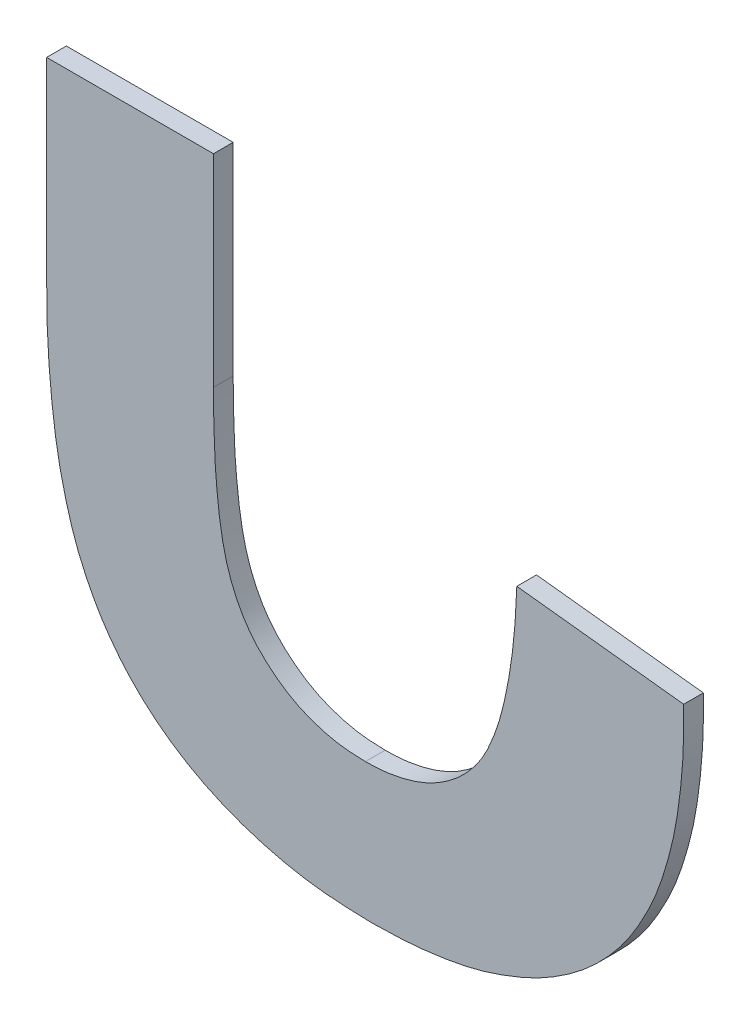
ISO-10303-21;
HEADER;
FILE_DESCRIPTION(('STEP AP214'),'2;1');
FILE_NAME('part.step','',(''),(''),'','','');
FILE_SCHEMA(('AUTOMOTIVE_DESIGN { 1 0 10303 214 1 1 1 1 }'));
ENDSEC;
DATA;
#1=APPLICATION_CONTEXT('core data for automotive mechanical design processes');
#2=APPLICATION_PROTOCOL_DEFINITION('international standard','automotive_design',2000,#1);
#3=PRODUCT_CONTEXT('',#1,'mechanical');
#4=PRODUCT('Part','Part','',(#3));
#5=PRODUCT_RELATED_PRODUCT_CATEGORY('part','',(#4));
#6=PRODUCT_DEFINITION_FORMATION('','',#4);
#7=PRODUCT_DEFINITION_CONTEXT('part definition',#1,'design');
#8=PRODUCT_DEFINITION('design','',#6,#7);
#9=PRODUCT_DEFINITION_SHAPE('','',#8);
#10=(LENGTH_UNIT() NAMED_UNIT(*) SI_UNIT(.MILLI.,.METRE.));
#11=(NAMED_UNIT(*) PLANE_ANGLE_UNIT() SI_UNIT($,.RADIAN.));
#12=(NAMED_UNIT(*) SI_UNIT($,.STERADIAN.) SOLID_ANGLE_UNIT());
#13=UNCERTAINTY_MEASURE_WITH_UNIT(LENGTH_MEASURE(1.E-05),#10,'distance_accuracy_value','');
#14=(GEOMETRIC_REPRESENTATION_CONTEXT(3) GLOBAL_UNCERTAINTY_ASSIGNED_CONTEXT((#13)) GLOBAL_UNIT_ASSIGNED_CONTEXT((#10,
#11,#12)) REPRESENTATION_CONTEXT('',''));
#15=CARTESIAN_POINT('',(0.,0.,0.));
#16=DIRECTION('',(0.,0.,1.));
#17=DIRECTION('',(1.,0.,0.));
#18=AXIS2_PLACEMENT_3D('',#15,#16,#17);
#19=CARTESIAN_POINT('',(1.15985576923078,-11.9230769230769,0.5));
#20=CARTESIAN_POINT('',(0.952681705237185,-11.9161438324762,0.5));
#21=CARTESIAN_POINT('',(0.547863750540508,-11.9025965790092,0.5));
#22=CARTESIAN_POINT('',(-0.032799948601432,-11.763362607753,0.5));
#23=CARTESIAN_POINT('',(-0.573838441220943,-11.5544629402978,0.5));
#24=CARTESIAN_POINT('',(-1.05994932250137,-11.2494384315448,0.5));
#25=CARTESIAN_POINT('',(-1.49335071651951,-10.878283181554,0.5));
#26=CARTESIAN_POINT('',(-1.86201258483458,-10.4402967865466,0.5));
#27=CARTESIAN_POINT('',(-2.14283461856344,-9.93412421585018,0.5));
#28=CARTESIAN_POINT('',(-2.31970215721966,-9.46678875517175,0.5));
#29=CARTESIAN_POINT('',(-2.42819410064458,-9.05083766607445,0.5));
#30=CARTESIAN_POINT('',(-2.49919635358074,-8.68949218820357,0.5));
#31=CARTESIAN_POINT('',(-2.55905493719061,-8.28637233568953,0.5));
#32=CARTESIAN_POINT('',(-2.60426724061429,-7.8389515636549,0.5));
#33=CARTESIAN_POINT('',(-2.6501684689034,-7.34852799709661,0.5));
#34=CARTESIAN_POINT('',(-2.6685057339471,-6.81295786338951,0.5));
#35=CARTESIAN_POINT('',(-2.68987936086344,-6.23614177366569,0.5));
#36=CARTESIAN_POINT('',(-2.69147960263964,-5.83736681973611,0.5));
#37=CARTESIAN_POINT('',(-2.69230769230768,-5.63100961538462,0.5));
#38=B_SPLINE_CURVE_WITH_KNOTS('',3,(#19,#20,#21,#22,#23,#24,#25,#26,#27,#28,#29,#30,#31,#32,#33,
#34,#35,#36,#37),.UNSPECIFIED.,.F.,.F.,(4,1,1,1,1,1,1,1,1,1,1,1,1,1,1,1,4),(0.,
0.0735942393366711,0.143803084572642,0.211314618374481,0.27917152037263,0.346904742846469,
0.413716381936235,0.481711687395285,0.551880712199704,0.590958340806243,0.634577157821114,
0.682868023604495,0.73592724163968,0.794594595566814,0.858103431572018,0.926571669360561,1.),.UNSPECIFIED.);
#39=DIRECTION('',(0.,0.,-1.));
#40=VECTOR('',#39,1.);
#41=SURFACE_OF_LINEAR_EXTRUSION('',#38,#40);
#42=CARTESIAN_POINT('',(1.15985576923078,-11.9230769230769,0.));
#43=CARTESIAN_POINT('',(0.952681705237185,-11.9161438324762,0.));
#44=CARTESIAN_POINT('',(0.547863750540508,-11.9025965790092,0.));
#45=CARTESIAN_POINT('',(-0.032799948601432,-11.763362607753,0.));
#46=CARTESIAN_POINT('',(-0.573838441220943,-11.5544629402978,0.));
#47=CARTESIAN_POINT('',(-1.05994932250137,-11.2494384315448,0.));
#48=CARTESIAN_POINT('',(-1.49335071651951,-10.878283181554,0.));
#49=CARTESIAN_POINT('',(-1.86201258483458,-10.4402967865466,0.));
#50=CARTESIAN_POINT('',(-2.14283461856344,-9.93412421585018,0.));
#51=CARTESIAN_POINT('',(-2.31970215721966,-9.46678875517175,0.));
#52=CARTESIAN_POINT('',(-2.42819410064458,-9.05083766607445,0.));
#53=CARTESIAN_POINT('',(-2.49919635358074,-8.68949218820357,0.));
#54=CARTESIAN_POINT('',(-2.55905493719061,-8.28637233568953,0.));
#55=CARTESIAN_POINT('',(-2.60426724061429,-7.8389515636549,0.));
#56=CARTESIAN_POINT('',(-2.6501684689034,-7.34852799709661,0.));
#57=CARTESIAN_POINT('',(-2.6685057339471,-6.81295786338951,0.));
#58=CARTESIAN_POINT('',(-2.68987936086344,-6.23614177366569,0.));
#59=CARTESIAN_POINT('',(-2.69147960263964,-5.83736681973611,0.));
#60=CARTESIAN_POINT('',(-2.69230769230768,-5.63100961538462,0.));
#61=B_SPLINE_CURVE_WITH_KNOTS('',3,(#42,#43,#44,#45,#46,#47,#48,#49,#50,#51,#52,#53,#54,#55,#56,
#57,#58,#59,#60),.UNSPECIFIED.,.F.,.F.,(4,1,1,1,1,1,1,1,1,1,1,1,1,1,1,1,4),(0.,
0.0735942393366711,0.143803084572642,0.211314618374481,0.27917152037263,0.346904742846469,
0.413716381936235,0.481711687395285,0.551880712199704,0.590958340806243,0.634577157821114,
0.682868023604495,0.73592724163968,0.794594595566814,0.858103431572018,0.926571669360561,1.),.UNSPECIFIED.);
#62=CARTESIAN_POINT('',(1.15985576923078,-11.9230769230769,0.));
#63=VERTEX_POINT('',#62);
#64=CARTESIAN_POINT('',(-2.69230769230768,-5.63100961538462,0.));
#65=VERTEX_POINT('',#64);
#66=EDGE_CURVE('E146',#63,#65,#61,.T.);
#67=ORIENTED_EDGE('',*,*,#66,.T.);
#68=DIRECTION('',(0.,0.,-1.));
#69=VECTOR('',#68,1.);
#70=CARTESIAN_POINT('',(-2.69230769230768,-5.63100961538462,0.5));
#71=LINE('',#70,#69);
#72=CARTESIAN_POINT('',(-2.69230769230768,-5.63100961538462,0.5));
#73=VERTEX_POINT('',#72);
#74=EDGE_CURVE('E170',#73,#65,#71,.T.);
#75=ORIENTED_EDGE('',*,*,#74,.F.);
#76=CARTESIAN_POINT('',(1.15985576923078,-11.9230769230769,0.5));
#77=VERTEX_POINT('',#76);
#78=EDGE_CURVE('E196',#77,#73,#38,.T.);
#79=ORIENTED_EDGE('',*,*,#78,.F.);
#80=DIRECTION('',(0.,0.,-1.));
#81=VECTOR('',#80,1.);
#82=CARTESIAN_POINT('',(1.15985576923078,-11.9230769230769,0.5));
#83=LINE('',#82,#81);
#84=EDGE_CURVE('E175',#77,#63,#83,.T.);
#85=ORIENTED_EDGE('',*,*,#84,.T.);
#86=EDGE_LOOP('',(#67,#75,#79,#85));
#87=FACE_BOUND('',#86,.T.);
#88=ADVANCED_FACE('F39',(#87),#41,.F.);
#89=CARTESIAN_POINT('',(5.00000000000001,-6.15384615384616,0.5));
#90=CARTESIAN_POINT('',(4.98856918952708,-6.42043741379355,0.5));
#91=CARTESIAN_POINT('',(4.96670234798915,-6.93041952315262,0.5));
#92=CARTESIAN_POINT('',(4.89420539736638,-7.66256876119748,0.5));
#93=CARTESIAN_POINT('',(4.79300154625236,-8.32847650193863,0.5));
#94=CARTESIAN_POINT('',(4.66767653580507,-8.93057463982405,0.5));
#95=CARTESIAN_POINT('',(4.52167563144463,-9.46928108839123,0.5));
#96=CARTESIAN_POINT('',(4.33849336266681,-9.94024964370403,0.5));
#97=CARTESIAN_POINT('',(4.14120744960806,-10.3533755180041,0.5));
#98=CARTESIAN_POINT('',(3.89864166780368,-10.6958074578512,0.5));
#99=CARTESIAN_POINT('',(3.63856944258544,-10.9884676468021,0.5));
#100=CARTESIAN_POINT('',(3.35246727573363,-11.2369637779818,0.5));
#101=CARTESIAN_POINT('',(3.04402596997071,-11.4487161365401,0.5));
#102=CARTESIAN_POINT('',(2.71386028716153,-11.6236399860127,0.5));
#103=CARTESIAN_POINT('',(2.35825549843146,-11.7578144068067,0.5));
#104=CARTESIAN_POINT('',(1.98090808143487,-11.8510166509758,0.5));
#105=CARTESIAN_POINT('',(1.57870748483097,-11.9155382902206,0.5));
#106=CARTESIAN_POINT('',(1.3023539002195,-11.920512194195,0.5));
#107=CARTESIAN_POINT('',(1.15985576923078,-11.9230769230769,0.5));
#108=B_SPLINE_CURVE_WITH_KNOTS('',3,(#89,#90,#91,#92,#93,#94,#95,#96,#97,#98,#99,#100,#101,#102,
#103,#104,#105,#106,#107),.UNSPECIFIED.,.F.,.F.,(4,1,1,1,1,1,1,1,1,1,1,1,1,1,1,1,4),(0.,
0.102038712697641,0.195197389247103,0.281231403879794,0.359517329992388,0.430343554209353,
0.494370791233012,0.552618193978707,0.604901827841917,0.654275293347834,0.702059837392702,
0.749449664968405,0.797086573611867,0.844612454737341,0.89441207169847,0.945554958300642,1.),.UNSPECIFIED.);
#109=DIRECTION('',(0.,0.,-1.));
#110=VECTOR('',#109,1.);
#111=SURFACE_OF_LINEAR_EXTRUSION('',#108,#110);
#112=CARTESIAN_POINT('',(5.00000000000001,-6.15384615384616,0.));
#113=CARTESIAN_POINT('',(4.98856918952708,-6.42043741379355,0.));
#114=CARTESIAN_POINT('',(4.96670234798915,-6.93041952315262,0.));
#115=CARTESIAN_POINT('',(4.89420539736638,-7.66256876119748,0.));
#116=CARTESIAN_POINT('',(4.79300154625236,-8.32847650193863,0.));
#117=CARTESIAN_POINT('',(4.66767653580507,-8.93057463982405,0.));
#118=CARTESIAN_POINT('',(4.52167563144463,-9.46928108839123,0.));
#119=CARTESIAN_POINT('',(4.33849336266681,-9.94024964370403,0.));
#120=CARTESIAN_POINT('',(4.14120744960806,-10.3533755180041,0.));
#121=CARTESIAN_POINT('',(3.89864166780368,-10.6958074578512,0.));
#122=CARTESIAN_POINT('',(3.63856944258544,-10.9884676468021,0.));
#123=CARTESIAN_POINT('',(3.35246727573363,-11.2369637779818,0.));
#124=CARTESIAN_POINT('',(3.04402596997071,-11.4487161365401,0.));
#125=CARTESIAN_POINT('',(2.71386028716153,-11.6236399860127,0.));
#126=CARTESIAN_POINT('',(2.35825549843146,-11.7578144068067,0.));
#127=CARTESIAN_POINT('',(1.98090808143487,-11.8510166509758,0.));
#128=CARTESIAN_POINT('',(1.57870748483097,-11.9155382902206,0.));
#129=CARTESIAN_POINT('',(1.3023539002195,-11.920512194195,0.));
#130=CARTESIAN_POINT('',(1.15985576923078,-11.9230769230769,0.));
#131=B_SPLINE_CURVE_WITH_KNOTS('',3,(#112,#113,#114,#115,#116,#117,#118,#119,#120,#121,#122,
#123,#124,#125,#126,#127,#128,#129,#130),.UNSPECIFIED.,.F.,.F.,(4,1,1,1,1,1,1,1,1,1,1,1,1,1,1,1,
4),(0.,0.102038712697641,0.195197389247103,0.281231403879794,0.359517329992388,
0.430343554209353,0.494370791233012,0.552618193978707,0.604901827841917,0.654275293347834,
0.702059837392702,0.749449664968405,0.797086573611867,0.844612454737341,0.89441207169847,
0.945554958300642,1.),.UNSPECIFIED.);
#132=CARTESIAN_POINT('',(5.00000000000001,-6.15384615384616,0.));
#133=VERTEX_POINT('',#132);
#134=EDGE_CURVE('E135',#133,#63,#131,.T.);
#135=ORIENTED_EDGE('',*,*,#134,.T.);
#136=ORIENTED_EDGE('',*,*,#84,.F.);
#137=CARTESIAN_POINT('',(5.00000000000001,-6.15384615384616,0.5));
#138=VERTEX_POINT('',#137);
#139=EDGE_CURVE('E183',#138,#77,#108,.T.);
#140=ORIENTED_EDGE('',*,*,#139,.F.);
#141=DIRECTION('',(0.,0.,-1.));
#142=VECTOR('',#141,1.);
#143=CARTESIAN_POINT('',(5.00000000000001,-6.15384615384616,0.5));
#144=LINE('',#143,#142);
#145=EDGE_CURVE('E172',#138,#133,#144,.T.);
#146=ORIENTED_EDGE('',*,*,#145,.T.);
#147=EDGE_LOOP('',(#135,#136,#140,#146));
#148=FACE_BOUND('',#147,.T.);
#149=ADVANCED_FACE('F210',(#148),#111,.F.);
#150=CARTESIAN_POINT('',(9.23076923076924,-6.62860576923077,0.5));
#151=DIRECTION('',(-0.111515978178344,-0.993762640981702,0.));
#152=DIRECTION('',(0.993762640981702,-0.111515978178344,0.));
#153=AXIS2_PLACEMENT_3D('',#150,#151,#152);
#154=PLANE('',#153);
#155=DIRECTION('',(-0.993762640981702,0.111515978178344,0.));
#156=VECTOR('',#155,1.);
#157=CARTESIAN_POINT('',(9.23076923076924,-6.62860576923077,0.));
#158=LINE('',#157,#156);
#159=CARTESIAN_POINT('',(9.23076923076924,-6.62860576923077,0.));
#160=VERTEX_POINT('',#159);
#161=EDGE_CURVE('E129',#160,#133,#158,.T.);
#162=ORIENTED_EDGE('',*,*,#161,.T.);
#163=ORIENTED_EDGE('',*,*,#145,.F.);
#164=DIRECTION('',(-0.993762640981702,0.111515978178344,0.));
#165=VECTOR('',#164,1.);
#166=CARTESIAN_POINT('',(9.23076923076924,-6.62860576923077,0.5));
#167=LINE('',#166,#165);
#168=CARTESIAN_POINT('',(9.23076923076924,-6.62860576923077,0.5));
#169=VERTEX_POINT('',#168);
#170=EDGE_CURVE('E179',#169,#138,#167,.T.);
#171=ORIENTED_EDGE('',*,*,#170,.F.);
#172=DIRECTION('',(0.,0.,-1.));
#173=VECTOR('',#172,1.);
#174=CARTESIAN_POINT('',(9.23076923076924,-6.62860576923077,0.5));
#175=LINE('',#174,#173);
#176=EDGE_CURVE('E47',#169,#160,#175,.T.);
#177=ORIENTED_EDGE('',*,*,#176,.T.);
#178=EDGE_LOOP('',(#162,#163,#171,#177));
#179=FACE_BOUND('',#178,.T.);
#180=ADVANCED_FACE('F178',(#179),#154,.F.);
#181=CARTESIAN_POINT('',(1.33413461538463,-15.3846153846154,0.5));
#182=CARTESIAN_POINT('',(1.64697204297438,-15.3777810836045,0.5));
#183=CARTESIAN_POINT('',(2.25634405175313,-15.3644686364089,0.5));
#184=CARTESIAN_POINT('',(3.14226779839153,-15.2586439686878,0.5));
#185=CARTESIAN_POINT('',(3.97475532647079,-15.0994896379203,0.5));
#186=CARTESIAN_POINT('',(4.74345539673001,-14.8434885820246,0.5));
#187=CARTESIAN_POINT('',(5.46396343536028,-14.5439627228662,0.5));
#188=CARTESIAN_POINT('',(6.12233283695792,-14.1590059929966,0.5));
#189=CARTESIAN_POINT('',(6.72983296488431,-13.7148472375036,0.5));
#190=CARTESIAN_POINT('',(7.27108285556904,-13.192444421731,0.5));
#191=CARTESIAN_POINT('',(7.75914250892462,-12.608767769219,0.5));
#192=CARTESIAN_POINT('',(8.16271410144135,-11.9456294110096,0.5));
#193=CARTESIAN_POINT('',(8.51936648214589,-11.2270221954942,0.5));
#194=CARTESIAN_POINT('',(8.78862199297982,-10.4329306122483,0.5));
#195=CARTESIAN_POINT('',(9.00948310050835,-9.57808194741498,0.5));
#196=CARTESIAN_POINT('',(9.14609399862845,-8.65156932718369,0.5));
#197=CARTESIAN_POINT('',(9.23582496396126,-7.66205994299396,0.5));
#198=CARTESIAN_POINT('',(9.23248525887689,-6.97938306359975,0.5));
#199=CARTESIAN_POINT('',(9.23076923076924,-6.62860576923077,0.5));
#200=B_SPLINE_CURVE_WITH_KNOTS('',3,(#181,#182,#183,#184,#185,#186,#187,#188,#189,#190,#191,
#192,#193,#194,#195,#196,#197,#198,#199),.UNSPECIFIED.,.F.,.F.,(4,1,1,1,1,1,1,1,1,1,1,1,1,1,1,1,
4),(0.,0.0693843382785906,0.135152861728727,0.197735709463306,0.257048427431989,
0.314589610141293,0.370543527787568,0.425833354216039,0.481158895283226,0.537040396648158,
0.594138756110102,0.652974991844991,0.714682156212668,0.779789612023037,0.848620873254807,
0.922217432424638,1.),.UNSPECIFIED.);
#201=DIRECTION('',(0.,0.,-1.));
#202=VECTOR('',#201,1.);
#203=SURFACE_OF_LINEAR_EXTRUSION('',#200,#202);
#204=CARTESIAN_POINT('',(1.33413461538463,-15.3846153846154,0.));
#205=CARTESIAN_POINT('',(1.64697204297438,-15.3777810836045,0.));
#206=CARTESIAN_POINT('',(2.25634405175313,-15.3644686364089,0.));
#207=CARTESIAN_POINT('',(3.14226779839153,-15.2586439686878,0.));
#208=CARTESIAN_POINT('',(3.97475532647079,-15.0994896379203,0.));
#209=CARTESIAN_POINT('',(4.74345539673001,-14.8434885820246,0.));
#210=CARTESIAN_POINT('',(5.46396343536028,-14.5439627228662,0.));
#211=CARTESIAN_POINT('',(6.12233283695792,-14.1590059929966,0.));
#212=CARTESIAN_POINT('',(6.72983296488431,-13.7148472375036,0.));
#213=CARTESIAN_POINT('',(7.27108285556904,-13.192444421731,0.));
#214=CARTESIAN_POINT('',(7.75914250892462,-12.608767769219,0.));
#215=CARTESIAN_POINT('',(8.16271410144135,-11.9456294110096,0.));
#216=CARTESIAN_POINT('',(8.51936648214589,-11.2270221954942,0.));
#217=CARTESIAN_POINT('',(8.78862199297982,-10.4329306122483,0.));
#218=CARTESIAN_POINT('',(9.00948310050835,-9.57808194741498,0.));
#219=CARTESIAN_POINT('',(9.14609399862845,-8.65156932718369,0.));
#220=CARTESIAN_POINT('',(9.23582496396126,-7.66205994299396,0.));
#221=CARTESIAN_POINT('',(9.23248525887689,-6.97938306359975,0.));
#222=CARTESIAN_POINT('',(9.23076923076924,-6.62860576923077,0.));
#223=B_SPLINE_CURVE_WITH_KNOTS('',3,(#204,#205,#206,#207,#208,#209,#210,#211,#212,#213,#214,
#215,#216,#217,#218,#219,#220,#221,#222),.UNSPECIFIED.,.F.,.F.,(4,1,1,1,1,1,1,1,1,1,1,1,1,1,1,1,
4),(0.,0.0693843382785906,0.135152861728727,0.197735709463306,0.257048427431989,
0.314589610141293,0.370543527787568,0.425833354216039,0.481158895283226,0.537040396648158,
0.594138756110102,0.652974991844991,0.714682156212668,0.779789612023037,0.848620873254807,
0.922217432424638,1.),.UNSPECIFIED.);
#224=CARTESIAN_POINT('',(1.33413461538463,-15.3846153846154,0.));
#225=VERTEX_POINT('',#224);
#226=EDGE_CURVE('E121',#225,#160,#223,.T.);
#227=ORIENTED_EDGE('',*,*,#226,.T.);
#228=ORIENTED_EDGE('',*,*,#176,.F.);
#229=CARTESIAN_POINT('',(1.33413461538463,-15.3846153846154,0.5));
#230=VERTEX_POINT('',#229);
#231=EDGE_CURVE('E120',#230,#169,#200,.T.);
#232=ORIENTED_EDGE('',*,*,#231,.F.);
#233=DIRECTION('',(0.,0.,-1.));
#234=VECTOR('',#233,1.);
#235=CARTESIAN_POINT('',(1.33413461538463,-15.3846153846154,0.5));
#236=LINE('',#235,#234);
#237=EDGE_CURVE('E111',#230,#225,#236,.T.);
#238=ORIENTED_EDGE('',*,*,#237,.T.);
#239=EDGE_LOOP('',(#227,#228,#232,#238));
#240=FACE_BOUND('',#239,.T.);
#241=ADVANCED_FACE('F41',(#240),#203,.F.);
#242=CARTESIAN_POINT('',(-6.92307692307691,-5.36057692307692,0.5));
#243=CARTESIAN_POINT('',(-6.92134861861226,-5.66511029976652,0.5));
#244=CARTESIAN_POINT('',(-6.91800389323548,-6.25446277435706,0.5));
#245=CARTESIAN_POINT('',(-6.87582776754538,-7.11258006021897,0.5));
#246=CARTESIAN_POINT('',(-6.80247426185395,-7.91810977193164,0.5));
#247=CARTESIAN_POINT('',(-6.71032933269542,-8.67281918265768,0.5));
#248=CARTESIAN_POINT('',(-6.58393278425979,-9.37511324530207,0.5));
#249=CARTESIAN_POINT('',(-6.42756953171694,-10.0226491590185,0.5));
#250=CARTESIAN_POINT('',(-6.25037078004622,-10.6206847865913,0.5));
#251=CARTESIAN_POINT('',(-5.97224827939595,-11.3344479017989,0.5));
#252=CARTESIAN_POINT('',(-5.54879281405862,-12.1442242746847,0.5));
#253=CARTESIAN_POINT('',(-4.90083059375915,-13.0030535828272,0.5));
#254=CARTESIAN_POINT('',(-4.11766944120387,-13.7356975398891,0.5));
#255=CARTESIAN_POINT('',(-3.20818800143308,-14.3386906035863,0.5));
#256=CARTESIAN_POINT('',(-2.19421169760531,-14.8040465374964,0.5));
#257=CARTESIAN_POINT('',(-1.09322136330097,-15.1419168620416,0.5));
#258=CARTESIAN_POINT('',(0.0922373748224589,-15.3510034867343,0.5));
#259=CARTESIAN_POINT('',(0.9125773434523,-15.3732059543401,0.5));
#260=CARTESIAN_POINT('',(1.33413461538463,-15.3846153846154,0.5));
#261=B_SPLINE_CURVE_WITH_KNOTS('',3,(#242,#243,#244,#245,#246,#247,#248,#249,#250,#251,#252,
#253,#254,#255,#256,#257,#258,#259,#260),.UNSPECIFIED.,.F.,.F.,(4,1,1,1,1,1,1,1,1,1,1,1,1,1,1,1,
4),(0.,0.0612110271793111,0.118459496073977,0.172633105891416,0.223776858970695,
0.271245742450752,0.315976480895031,0.357630860452254,0.396515037172753,0.469825177533055,
0.540534635237423,0.611753614325462,0.684345849432641,0.758929938304453,0.835221686293591,
0.91532352554307,1.),.UNSPECIFIED.);
#262=DIRECTION('',(0.,0.,-1.));
#263=VECTOR('',#262,1.);
#264=SURFACE_OF_LINEAR_EXTRUSION('',#261,#263);
#265=CARTESIAN_POINT('',(-6.92307692307691,-5.36057692307692,0.));
#266=CARTESIAN_POINT('',(-6.92134861861226,-5.66511029976652,0.));
#267=CARTESIAN_POINT('',(-6.91800389323548,-6.25446277435706,0.));
#268=CARTESIAN_POINT('',(-6.87582776754538,-7.11258006021897,0.));
#269=CARTESIAN_POINT('',(-6.80247426185395,-7.91810977193164,0.));
#270=CARTESIAN_POINT('',(-6.71032933269542,-8.67281918265768,0.));
#271=CARTESIAN_POINT('',(-6.58393278425979,-9.37511324530207,0.));
#272=CARTESIAN_POINT('',(-6.42756953171694,-10.0226491590185,0.));
#273=CARTESIAN_POINT('',(-6.25037078004622,-10.6206847865913,0.));
#274=CARTESIAN_POINT('',(-5.97224827939595,-11.3344479017989,0.));
#275=CARTESIAN_POINT('',(-5.54879281405862,-12.1442242746847,0.));
#276=CARTESIAN_POINT('',(-4.90083059375915,-13.0030535828272,0.));
#277=CARTESIAN_POINT('',(-4.11766944120387,-13.7356975398891,0.));
#278=CARTESIAN_POINT('',(-3.20818800143308,-14.3386906035863,0.));
#279=CARTESIAN_POINT('',(-2.19421169760531,-14.8040465374964,0.));
#280=CARTESIAN_POINT('',(-1.09322136330097,-15.1419168620416,0.));
#281=CARTESIAN_POINT('',(0.0922373748224589,-15.3510034867343,0.));
#282=CARTESIAN_POINT('',(0.9125773434523,-15.3732059543401,0.));
#283=CARTESIAN_POINT('',(1.33413461538463,-15.3846153846154,0.));
#284=B_SPLINE_CURVE_WITH_KNOTS('',3,(#265,#266,#267,#268,#269,#270,#271,#272,#273,#274,#275,
#276,#277,#278,#279,#280,#281,#282,#283),.UNSPECIFIED.,.F.,.F.,(4,1,1,1,1,1,1,1,1,1,1,1,1,1,1,1,
4),(0.,0.0612110271793111,0.118459496073977,0.172633105891416,0.223776858970695,
0.271245742450752,0.315976480895031,0.357630860452254,0.396515037172753,0.469825177533055,
0.540534635237423,0.611753614325462,0.684345849432641,0.758929938304453,0.835221686293591,
0.91532352554307,1.),.UNSPECIFIED.);
#285=CARTESIAN_POINT('',(-6.92307692307691,-5.36057692307692,0.));
#286=VERTEX_POINT('',#285);
#287=EDGE_CURVE('E106',#286,#225,#284,.T.);
#288=ORIENTED_EDGE('',*,*,#287,.T.);
#289=ORIENTED_EDGE('',*,*,#237,.F.);
#290=CARTESIAN_POINT('',(-6.92307692307691,-5.36057692307692,0.5));
#291=VERTEX_POINT('',#290);
#292=EDGE_CURVE('E124',#291,#230,#261,.T.);
#293=ORIENTED_EDGE('',*,*,#292,.F.);
#294=DIRECTION('',(0.,0.,-1.));
#295=VECTOR('',#294,1.);
#296=CARTESIAN_POINT('',(-6.92307692307691,-5.36057692307692,0.5));
#297=LINE('',#296,#295);
#298=EDGE_CURVE('E113',#291,#286,#297,.T.);
#299=ORIENTED_EDGE('',*,*,#298,.T.);
#300=EDGE_LOOP('',(#288,#289,#293,#299));
#301=FACE_BOUND('',#300,.T.);
#302=ADVANCED_FACE('F112',(#301),#264,.F.);
#303=CARTESIAN_POINT('',(7.42992576682308,-12.9952354620521,0.5));
#304=DIRECTION('',(0.,0.,-1.));
#305=DIRECTION('',(-1.,0.,0.));
#306=AXIS2_PLACEMENT_3D('',#303,#304,#305);
#307=PLANE('',#306);
#308=DIRECTION('',(0.,1.,0.));
#309=VECTOR('',#308,1.);
#310=CARTESIAN_POINT('',(-2.69230769230768,-5.63100961538462,0.5));
#311=LINE('',#310,#309);
#312=CARTESIAN_POINT('',(-2.69230769230768,-0.5,0.5));
#313=VERTEX_POINT('',#312);
#314=EDGE_CURVE('E231',#73,#313,#311,.T.);
#315=ORIENTED_EDGE('',*,*,#314,.T.);
#316=DIRECTION('',(-1.,0.,0.));
#317=VECTOR('',#316,1.);
#318=CARTESIAN_POINT('',(7.42992576682308,-0.5,0.5));
#319=LINE('',#318,#317);
#320=CARTESIAN_POINT('',(-6.92307692307691,-0.5,0.5));
#321=VERTEX_POINT('',#320);
#322=EDGE_CURVE('E74',#313,#321,#319,.T.);
#323=ORIENTED_EDGE('',*,*,#322,.T.);
#324=DIRECTION('',(0.,-1.,0.));
#325=VECTOR('',#324,1.);
#326=CARTESIAN_POINT('',(-6.92307692307691,15.,0.5));
#327=LINE('',#326,#325);
#328=EDGE_CURVE('E235',#321,#291,#327,.T.);
#329=ORIENTED_EDGE('',*,*,#328,.T.);
#330=ORIENTED_EDGE('',*,*,#292,.T.);
#331=ORIENTED_EDGE('',*,*,#231,.T.);
#332=ORIENTED_EDGE('',*,*,#170,.T.);
#333=ORIENTED_EDGE('',*,*,#139,.T.);
#334=ORIENTED_EDGE('',*,*,#78,.T.);
#335=EDGE_LOOP('',(#315,#323,#329,#330,#331,#332,#333,#334));
#336=FACE_BOUND('',#335,.T.);
#337=ADVANCED_FACE('F186',(#336),#307,.F.);
#338=CARTESIAN_POINT('',(-6.92307692307691,15.,0.5));
#339=DIRECTION('',(1.,0.,0.));
#340=DIRECTION('',(0.,0.,-1.));
#341=AXIS2_PLACEMENT_3D('',#338,#339,#340);
#342=PLANE('',#341);
#343=ORIENTED_EDGE('',*,*,#328,.F.);
#344=DIRECTION('',(0.,0.,-1.));
#345=VECTOR('',#344,1.);
#346=CARTESIAN_POINT('',(-6.92307692307691,-0.5,0.5));
#347=LINE('',#346,#345);
#348=CARTESIAN_POINT('',(-6.92307692307691,-0.5,0.));
#349=VERTEX_POINT('',#348);
#350=EDGE_CURVE('E57',#321,#349,#347,.T.);
#351=ORIENTED_EDGE('',*,*,#350,.T.);
#352=DIRECTION('',(0.,-1.,0.));
#353=VECTOR('',#352,1.);
#354=CARTESIAN_POINT('',(-6.92307692307691,15.,0.));
#355=LINE('',#354,#353);
#356=EDGE_CURVE('E104',#349,#286,#355,.T.);
#357=ORIENTED_EDGE('',*,*,#356,.T.);
#358=ORIENTED_EDGE('',*,*,#298,.F.);
#359=EDGE_LOOP('',(#343,#351,#357,#358));
#360=FACE_BOUND('',#359,.T.);
#361=ADVANCED_FACE('F233',(#360),#342,.F.);
#362=CARTESIAN_POINT('',(-2.69230769230768,-5.63100961538462,0.5));
#363=DIRECTION('',(-1.,0.,0.));
#364=DIRECTION('',(0.,0.,1.));
#365=AXIS2_PLACEMENT_3D('',#362,#363,#364);
#366=PLANE('',#365);
#367=DIRECTION('',(0.,1.,0.));
#368=VECTOR('',#367,1.);
#369=CARTESIAN_POINT('',(-2.69230769230768,-5.63100961538462,0.));
#370=LINE('',#369,#368);
#371=CARTESIAN_POINT('',(-2.69230769230768,-0.5,0.));
#372=VERTEX_POINT('',#371);
#373=EDGE_CURVE('E157',#65,#372,#370,.T.);
#374=ORIENTED_EDGE('',*,*,#373,.T.);
#375=DIRECTION('',(0.,0.,1.));
#376=VECTOR('',#375,1.);
#377=CARTESIAN_POINT('',(-2.69230769230768,-0.5,0.5));
#378=LINE('',#377,#376);
#379=EDGE_CURVE('E70',#372,#313,#378,.T.);
#380=ORIENTED_EDGE('',*,*,#379,.T.);
#381=ORIENTED_EDGE('',*,*,#314,.F.);
#382=ORIENTED_EDGE('',*,*,#74,.T.);
#383=EDGE_LOOP('',(#374,#380,#381,#382));
#384=FACE_BOUND('',#383,.T.);
#385=ADVANCED_FACE('F229',(#384),#366,.F.);
#386=CARTESIAN_POINT('',(7.42992576682308,-12.9952354620521,0.));
#387=DIRECTION('',(0.,0.,-1.));
#388=DIRECTION('',(-1.,0.,0.));
#389=AXIS2_PLACEMENT_3D('',#386,#387,#388);
#390=PLANE('',#389);
#391=DIRECTION('',(-1.,0.,0.));
#392=VECTOR('',#391,1.);
#393=CARTESIAN_POINT('',(7.42992576682308,-0.5,0.));
#394=LINE('',#393,#392);
#395=EDGE_CURVE('E11',#372,#349,#394,.T.);
#396=ORIENTED_EDGE('',*,*,#395,.F.);
#397=ORIENTED_EDGE('',*,*,#373,.F.);
#398=ORIENTED_EDGE('',*,*,#66,.F.);
#399=ORIENTED_EDGE('',*,*,#134,.F.);
#400=ORIENTED_EDGE('',*,*,#161,.F.);
#401=ORIENTED_EDGE('',*,*,#226,.F.);
#402=ORIENTED_EDGE('',*,*,#287,.F.);
#403=ORIENTED_EDGE('',*,*,#356,.F.);
#404=EDGE_LOOP('',(#396,#397,#398,#399,#400,#401,#402,#403));
#405=FACE_BOUND('',#404,.T.);
#406=ADVANCED_FACE('F130',(#405),#390,.T.);
#407=CARTESIAN_POINT('',(-17.,-0.5,1.));
#408=DIRECTION('',(0.,-1.,0.));
#409=DIRECTION('',(0.,0.,-1.));
#410=AXIS2_PLACEMENT_3D('',#407,#408,#409);
#411=PLANE('',#410);
#412=ORIENTED_EDGE('',*,*,#395,.T.);
#413=ORIENTED_EDGE('',*,*,#350,.F.);
#414=ORIENTED_EDGE('',*,*,#322,.F.);
#415=ORIENTED_EDGE('',*,*,#379,.F.);
#416=EDGE_LOOP('',(#412,#413,#414,#415));
#417=FACE_BOUND('',#416,.T.);
#418=ADVANCED_FACE('F250',(#417),#411,.F.);
#419=CLOSED_SHELL('',(#88,#149,#180,#241,#302,#337,#361,#385,#406,#418));
#420=MANIFOLD_SOLID_BREP('B2',#419);
#421=ADVANCED_BREP_SHAPE_REPRESENTATION('',(#18,#420),#14);
#422=SHAPE_DEFINITION_REPRESENTATION(#9,#421);
ENDSEC;
END-ISO-10303-21;
